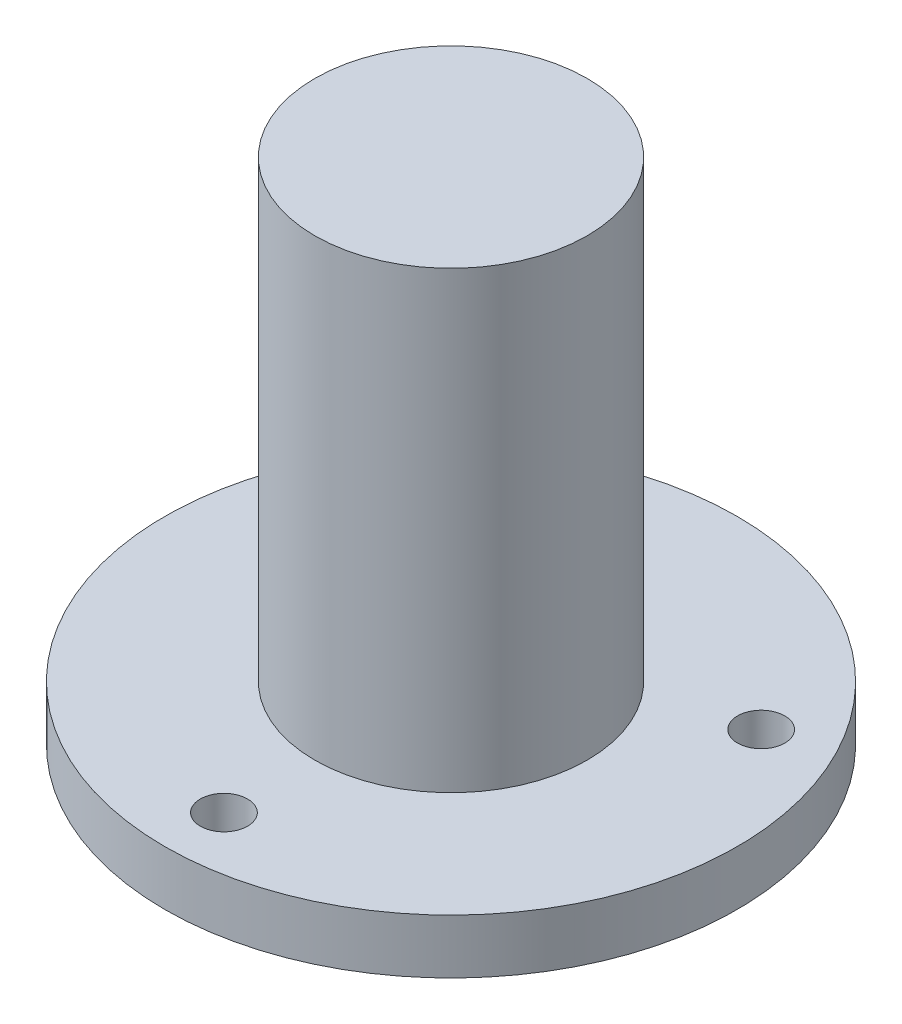
ISO-10303-21;
HEADER;
FILE_DESCRIPTION(('STEP AP214'),'2;1');
FILE_NAME('part.step','',(''),(''),'','','');
FILE_SCHEMA(('AUTOMOTIVE_DESIGN { 1 0 10303 214 1 1 1 1 }'));
ENDSEC;
DATA;
#1=APPLICATION_CONTEXT('core data for automotive mechanical design processes');
#2=APPLICATION_PROTOCOL_DEFINITION('international standard','automotive_design',2000,#1);
#3=PRODUCT_CONTEXT('',#1,'mechanical');
#4=PRODUCT('Part','Part','',(#3));
#5=PRODUCT_RELATED_PRODUCT_CATEGORY('part','',(#4));
#6=PRODUCT_DEFINITION_FORMATION('','',#4);
#7=PRODUCT_DEFINITION_CONTEXT('part definition',#1,'design');
#8=PRODUCT_DEFINITION('design','',#6,#7);
#9=PRODUCT_DEFINITION_SHAPE('','',#8);
#10=(LENGTH_UNIT() NAMED_UNIT(*) SI_UNIT(.MILLI.,.METRE.));
#11=(NAMED_UNIT(*) PLANE_ANGLE_UNIT() SI_UNIT($,.RADIAN.));
#12=(NAMED_UNIT(*) SI_UNIT($,.STERADIAN.) SOLID_ANGLE_UNIT());
#13=UNCERTAINTY_MEASURE_WITH_UNIT(LENGTH_MEASURE(1.E-05),#10,'distance_accuracy_value','');
#14=(GEOMETRIC_REPRESENTATION_CONTEXT(3) GLOBAL_UNCERTAINTY_ASSIGNED_CONTEXT((#13)) GLOBAL_UNIT_ASSIGNED_CONTEXT((#10,
#11,#12)) REPRESENTATION_CONTEXT('',''));
#15=CARTESIAN_POINT('',(0.,0.,0.));
#16=DIRECTION('',(0.,0.,1.));
#17=DIRECTION('',(1.,0.,0.));
#18=AXIS2_PLACEMENT_3D('',#15,#16,#17);
#19=CARTESIAN_POINT('',(0.,6.,0.));
#20=DIRECTION('',(0.,-1.,0.));
#21=DIRECTION('',(0.,0.,-1.));
#22=AXIS2_PLACEMENT_3D('',#19,#20,#21);
#23=CYLINDRICAL_SURFACE('',#22,31.5);
#24=CARTESIAN_POINT('',(0.,6.,0.));
#25=DIRECTION('',(0.,1.,0.));
#26=DIRECTION('',(0.,0.,1.));
#27=AXIS2_PLACEMENT_3D('',#24,#25,#26);
#28=CIRCLE('',#27,31.5);
#29=CARTESIAN_POINT('',(0.,6.,31.5));
#30=VERTEX_POINT('',#29);
#31=EDGE_CURVE('E10',#30,#30,#28,.T.);
#32=ORIENTED_EDGE('',*,*,#31,.F.);
#33=EDGE_LOOP('',(#32));
#34=FACE_BOUND('',#33,.T.);
#35=CARTESIAN_POINT('',(0.,0.,0.));
#36=DIRECTION('',(0.,1.,0.));
#37=DIRECTION('',(0.,0.,1.));
#38=AXIS2_PLACEMENT_3D('',#35,#36,#37);
#39=CIRCLE('',#38,31.5);
#40=CARTESIAN_POINT('',(0.,0.,31.5));
#41=VERTEX_POINT('',#40);
#42=EDGE_CURVE('E40',#41,#41,#39,.T.);
#43=ORIENTED_EDGE('',*,*,#42,.T.);
#44=EDGE_LOOP('',(#43));
#45=FACE_BOUND('',#44,.T.);
#46=ADVANCED_FACE('F37',(#34,#45),#23,.T.);
#47=CARTESIAN_POINT('',(0.,6.,0.));
#48=DIRECTION('',(0.,1.,0.));
#49=DIRECTION('',(0.,0.,1.));
#50=AXIS2_PLACEMENT_3D('',#47,#48,#49);
#51=PLANE('',#50);
#52=CARTESIAN_POINT('',(0.,6.,25.));
#53=DIRECTION('',(0.,1.,0.));
#54=DIRECTION('',(0.,0.,1.));
#55=AXIS2_PLACEMENT_3D('',#52,#53,#54);
#56=CIRCLE('',#55,2.6);
#57=CARTESIAN_POINT('',(0.,6.,27.6));
#58=VERTEX_POINT('',#57);
#59=EDGE_CURVE('E60',#58,#58,#56,.T.);
#60=ORIENTED_EDGE('',*,*,#59,.F.);
#61=EDGE_LOOP('',(#60));
#62=FACE_BOUND('',#61,.T.);
#63=CARTESIAN_POINT('',(21.6506350946109,6.,-12.5000000000001));
#64=DIRECTION('',(0.,1.,0.));
#65=DIRECTION('',(0.,0.,1.));
#66=AXIS2_PLACEMENT_3D('',#63,#64,#65);
#67=CIRCLE('',#66,2.6);
#68=CARTESIAN_POINT('',(21.6506350946109,6.,-9.9000000000001));
#69=VERTEX_POINT('',#68);
#70=EDGE_CURVE('E63',#69,#69,#67,.T.);
#71=ORIENTED_EDGE('',*,*,#70,.F.);
#72=EDGE_LOOP('',(#71));
#73=FACE_BOUND('',#72,.T.);
#74=CARTESIAN_POINT('',(-21.6506350946111,6.,-12.4999999999998));
#75=DIRECTION('',(0.,1.,0.));
#76=DIRECTION('',(0.,0.,1.));
#77=AXIS2_PLACEMENT_3D('',#74,#75,#76);
#78=CIRCLE('',#77,2.6);
#79=CARTESIAN_POINT('',(-21.6506350946111,6.,-9.8999999999998));
#80=VERTEX_POINT('',#79);
#81=EDGE_CURVE('E52',#80,#80,#78,.T.);
#82=ORIENTED_EDGE('',*,*,#81,.F.);
#83=EDGE_LOOP('',(#82));
#84=FACE_BOUND('',#83,.T.);
#85=CARTESIAN_POINT('',(0.,6.,0.));
#86=DIRECTION('',(0.,1.,0.));
#87=DIRECTION('',(0.,0.,1.));
#88=AXIS2_PLACEMENT_3D('',#85,#86,#87);
#89=CIRCLE('',#88,15.);
#90=CARTESIAN_POINT('',(0.,6.,15.));
#91=VERTEX_POINT('',#90);
#92=EDGE_CURVE('E49',#91,#91,#89,.T.);
#93=ORIENTED_EDGE('',*,*,#92,.F.);
#94=EDGE_LOOP('',(#93));
#95=FACE_BOUND('',#94,.T.);
#96=ORIENTED_EDGE('',*,*,#31,.T.);
#97=EDGE_LOOP('',(#96));
#98=FACE_BOUND('',#97,.T.);
#99=ADVANCED_FACE('F79',(#62,#73,#84,#95,#98),#51,.T.);
#100=CARTESIAN_POINT('',(0.,0.,0.));
#101=DIRECTION('',(0.,1.,0.));
#102=DIRECTION('',(0.,0.,1.));
#103=AXIS2_PLACEMENT_3D('',#100,#101,#102);
#104=PLANE('',#103);
#105=CARTESIAN_POINT('',(0.,0.,25.));
#106=DIRECTION('',(0.,-1.,0.));
#107=DIRECTION('',(0.,0.,-1.));
#108=AXIS2_PLACEMENT_3D('',#105,#106,#107);
#109=CIRCLE('',#108,2.6);
#110=CARTESIAN_POINT('',(0.,0.,22.4));
#111=VERTEX_POINT('',#110);
#112=EDGE_CURVE('E66',#111,#111,#109,.T.);
#113=ORIENTED_EDGE('',*,*,#112,.F.);
#114=EDGE_LOOP('',(#113));
#115=FACE_BOUND('',#114,.T.);
#116=CARTESIAN_POINT('',(21.6506350946109,0.,-12.5000000000001));
#117=DIRECTION('',(0.,-1.,0.));
#118=DIRECTION('',(0.,0.,-1.));
#119=AXIS2_PLACEMENT_3D('',#116,#117,#118);
#120=CIRCLE('',#119,2.6);
#121=CARTESIAN_POINT('',(21.6506350946109,0.,-15.1000000000001));
#122=VERTEX_POINT('',#121);
#123=EDGE_CURVE('E67',#122,#122,#120,.T.);
#124=ORIENTED_EDGE('',*,*,#123,.F.);
#125=EDGE_LOOP('',(#124));
#126=FACE_BOUND('',#125,.T.);
#127=CARTESIAN_POINT('',(-21.6506350946111,0.,-12.4999999999998));
#128=DIRECTION('',(0.,-1.,0.));
#129=DIRECTION('',(0.,0.,-1.));
#130=AXIS2_PLACEMENT_3D('',#127,#128,#129);
#131=CIRCLE('',#130,2.6);
#132=CARTESIAN_POINT('',(-21.6506350946111,0.,-15.0999999999998));
#133=VERTEX_POINT('',#132);
#134=EDGE_CURVE('E57',#133,#133,#131,.T.);
#135=ORIENTED_EDGE('',*,*,#134,.F.);
#136=EDGE_LOOP('',(#135));
#137=FACE_BOUND('',#136,.T.);
#138=ORIENTED_EDGE('',*,*,#42,.F.);
#139=EDGE_LOOP('',(#138));
#140=FACE_BOUND('',#139,.T.);
#141=ADVANCED_FACE('F75',(#115,#126,#137,#140),#104,.F.);
#142=CARTESIAN_POINT('',(0.,56.,0.));
#143=DIRECTION('',(0.,-1.,0.));
#144=DIRECTION('',(0.,0.,-1.));
#145=AXIS2_PLACEMENT_3D('',#142,#143,#144);
#146=CYLINDRICAL_SURFACE('',#145,15.);
#147=CARTESIAN_POINT('',(0.,56.,0.));
#148=DIRECTION('',(0.,1.,0.));
#149=DIRECTION('',(0.,0.,1.));
#150=AXIS2_PLACEMENT_3D('',#147,#148,#149);
#151=CIRCLE('',#150,15.);
#152=CARTESIAN_POINT('',(0.,56.,15.));
#153=VERTEX_POINT('',#152);
#154=EDGE_CURVE('E47',#153,#153,#151,.T.);
#155=ORIENTED_EDGE('',*,*,#154,.F.);
#156=EDGE_LOOP('',(#155));
#157=FACE_BOUND('',#156,.T.);
#158=ORIENTED_EDGE('',*,*,#92,.T.);
#159=EDGE_LOOP('',(#158));
#160=FACE_BOUND('',#159,.T.);
#161=ADVANCED_FACE('F78',(#157,#160),#146,.T.);
#162=CARTESIAN_POINT('',(0.,56.,0.));
#163=DIRECTION('',(0.,1.,0.));
#164=DIRECTION('',(0.,0.,1.));
#165=AXIS2_PLACEMENT_3D('',#162,#163,#164);
#166=PLANE('',#165);
#167=ORIENTED_EDGE('',*,*,#154,.T.);
#168=EDGE_LOOP('',(#167));
#169=FACE_BOUND('',#168,.T.);
#170=ADVANCED_FACE('F100',(#169),#166,.T.);
#171=CARTESIAN_POINT('',(-21.6506350946111,56.,-12.4999999999998));
#172=DIRECTION('',(0.,-1.,0.));
#173=DIRECTION('',(0.,0.,-1.));
#174=AXIS2_PLACEMENT_3D('',#171,#172,#173);
#175=CYLINDRICAL_SURFACE('',#174,2.6);
#176=ORIENTED_EDGE('',*,*,#81,.T.);
#177=EDGE_LOOP('',(#176));
#178=FACE_BOUND('',#177,.T.);
#179=ORIENTED_EDGE('',*,*,#134,.T.);
#180=EDGE_LOOP('',(#179));
#181=FACE_BOUND('',#180,.T.);
#182=ADVANCED_FACE('F104',(#178,#181),#175,.F.);
#183=CARTESIAN_POINT('',(21.6506350946109,56.,-12.5000000000001));
#184=DIRECTION('',(0.,-1.,0.));
#185=DIRECTION('',(0.,0.,-1.));
#186=AXIS2_PLACEMENT_3D('',#183,#184,#185);
#187=CYLINDRICAL_SURFACE('',#186,2.6);
#188=ORIENTED_EDGE('',*,*,#70,.T.);
#189=EDGE_LOOP('',(#188));
#190=FACE_BOUND('',#189,.T.);
#191=ORIENTED_EDGE('',*,*,#123,.T.);
#192=EDGE_LOOP('',(#191));
#193=FACE_BOUND('',#192,.T.);
#194=ADVANCED_FACE('F108',(#190,#193),#187,.F.);
#195=CARTESIAN_POINT('',(0.,56.,25.));
#196=DIRECTION('',(0.,-1.,0.));
#197=DIRECTION('',(0.,0.,-1.));
#198=AXIS2_PLACEMENT_3D('',#195,#196,#197);
#199=CYLINDRICAL_SURFACE('',#198,2.6);
#200=ORIENTED_EDGE('',*,*,#59,.T.);
#201=EDGE_LOOP('',(#200));
#202=FACE_BOUND('',#201,.T.);
#203=ORIENTED_EDGE('',*,*,#112,.T.);
#204=EDGE_LOOP('',(#203));
#205=FACE_BOUND('',#204,.T.);
#206=ADVANCED_FACE('F73',(#202,#205),#199,.F.);
#207=CLOSED_SHELL('',(#46,#99,#141,#161,#170,#182,#194,#206));
#208=MANIFOLD_SOLID_BREP('B2',#207);
#209=ADVANCED_BREP_SHAPE_REPRESENTATION('',(#18,#208),#14);
#210=SHAPE_DEFINITION_REPRESENTATION(#9,#209);
ENDSEC;
END-ISO-10303-21;
